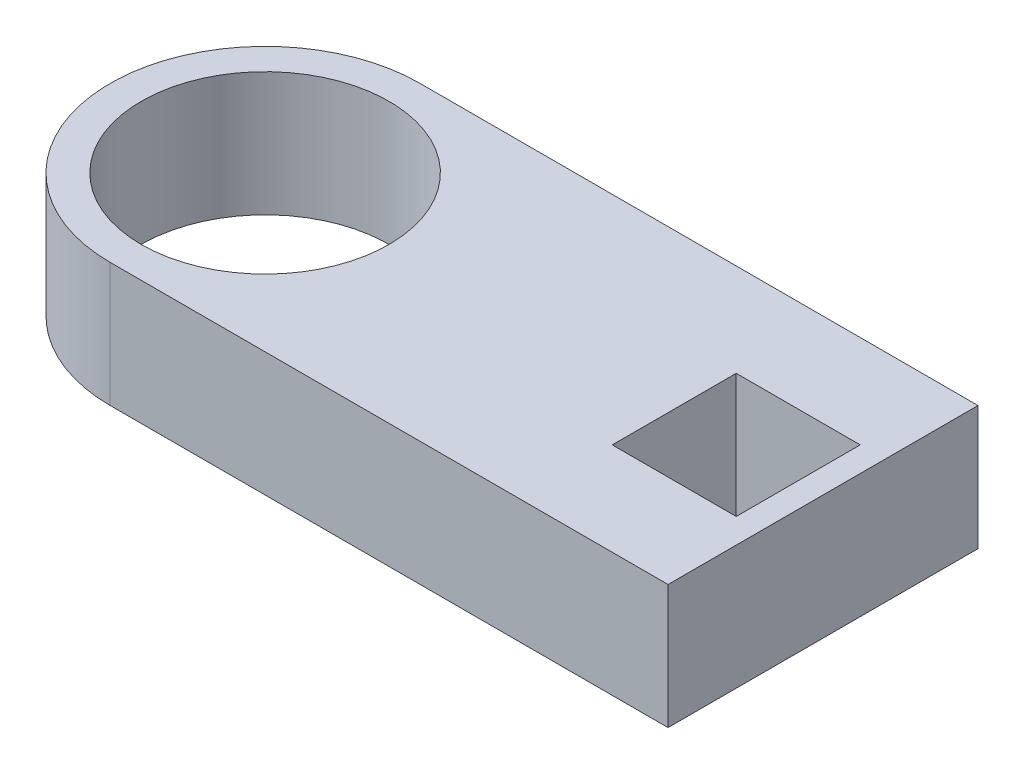
ISO-10303-21;
HEADER;
FILE_DESCRIPTION(('STEP AP214'),'2;1');
FILE_NAME('part.step','',(''),(''),'','','');
FILE_SCHEMA(('AUTOMOTIVE_DESIGN { 1 0 10303 214 1 1 1 1 }'));
ENDSEC;
DATA;
#1=APPLICATION_CONTEXT('core data for automotive mechanical design processes');
#2=APPLICATION_PROTOCOL_DEFINITION('international standard','automotive_design',2000,#1);
#3=PRODUCT_CONTEXT('',#1,'mechanical');
#4=PRODUCT('Part','Part','',(#3));
#5=PRODUCT_RELATED_PRODUCT_CATEGORY('part','',(#4));
#6=PRODUCT_DEFINITION_FORMATION('','',#4);
#7=PRODUCT_DEFINITION_CONTEXT('part definition',#1,'design');
#8=PRODUCT_DEFINITION('design','',#6,#7);
#9=PRODUCT_DEFINITION_SHAPE('','',#8);
#10=(LENGTH_UNIT() NAMED_UNIT(*) SI_UNIT(.MILLI.,.METRE.));
#11=(NAMED_UNIT(*) PLANE_ANGLE_UNIT() SI_UNIT($,.RADIAN.));
#12=(NAMED_UNIT(*) SI_UNIT($,.STERADIAN.) SOLID_ANGLE_UNIT());
#13=UNCERTAINTY_MEASURE_WITH_UNIT(LENGTH_MEASURE(1.E-05),#10,'distance_accuracy_value','');
#14=(GEOMETRIC_REPRESENTATION_CONTEXT(3) GLOBAL_UNCERTAINTY_ASSIGNED_CONTEXT((#13)) GLOBAL_UNIT_ASSIGNED_CONTEXT((#10,
#11,#12)) REPRESENTATION_CONTEXT('',''));
#15=CARTESIAN_POINT('',(0.,0.,0.));
#16=DIRECTION('',(0.,0.,1.));
#17=DIRECTION('',(1.,0.,0.));
#18=AXIS2_PLACEMENT_3D('',#15,#16,#17);
#19=CARTESIAN_POINT('',(0.,10.,-12.5));
#20=DIRECTION('',(0.,1.,0.));
#21=DIRECTION('',(0.,0.,1.));
#22=AXIS2_PLACEMENT_3D('',#19,#20,#21);
#23=PLANE('',#22);
#24=CARTESIAN_POINT('',(0.,10.,-12.5));
#25=DIRECTION('',(0.,1.,0.));
#26=DIRECTION('',(0.,0.,1.));
#27=AXIS2_PLACEMENT_3D('',#24,#25,#26);
#28=CIRCLE('',#27,12.5);
#29=CARTESIAN_POINT('',(0.,10.,-25.));
#30=VERTEX_POINT('',#29);
#31=CARTESIAN_POINT('',(0.,10.,0.));
#32=VERTEX_POINT('',#31);
#33=EDGE_CURVE('E140',#30,#32,#28,.T.);
#34=ORIENTED_EDGE('',*,*,#33,.T.);
#35=DIRECTION('',(1.,0.,0.));
#36=VECTOR('',#35,1.);
#37=CARTESIAN_POINT('',(0.,10.,0.));
#38=LINE('',#37,#36);
#39=CARTESIAN_POINT('',(45.,10.,0.));
#40=VERTEX_POINT('',#39);
#41=EDGE_CURVE('E143',#32,#40,#38,.T.);
#42=ORIENTED_EDGE('',*,*,#41,.T.);
#43=DIRECTION('',(0.,0.,-1.));
#44=VECTOR('',#43,1.);
#45=CARTESIAN_POINT('',(45.,10.,0.));
#46=LINE('',#45,#44);
#47=CARTESIAN_POINT('',(45.,10.,-25.));
#48=VERTEX_POINT('',#47);
#49=EDGE_CURVE('E146',#40,#48,#46,.T.);
#50=ORIENTED_EDGE('',*,*,#49,.T.);
#51=DIRECTION('',(-1.,0.,0.));
#52=VECTOR('',#51,1.);
#53=CARTESIAN_POINT('',(0.,10.,-25.));
#54=LINE('',#53,#52);
#55=EDGE_CURVE('E148',#48,#30,#54,.T.);
#56=ORIENTED_EDGE('',*,*,#55,.T.);
#57=EDGE_LOOP('',(#34,#42,#50,#56));
#58=FACE_BOUND('',#57,.T.);
#59=CARTESIAN_POINT('',(0.,10.,-12.5));
#60=DIRECTION('',(0.,1.,0.));
#61=DIRECTION('',(0.,0.,1.));
#62=AXIS2_PLACEMENT_3D('',#59,#60,#61);
#63=CIRCLE('',#62,10.);
#64=CARTESIAN_POINT('',(0.,10.,-2.5));
#65=VERTEX_POINT('',#64);
#66=EDGE_CURVE('E134',#65,#65,#63,.T.);
#67=ORIENTED_EDGE('',*,*,#66,.F.);
#68=EDGE_LOOP('',(#67));
#69=FACE_BOUND('',#68,.T.);
#70=DIRECTION('',(-1.,0.,0.));
#71=VECTOR('',#70,1.);
#72=CARTESIAN_POINT('',(43.,10.,-17.5));
#73=LINE('',#72,#71);
#74=CARTESIAN_POINT('',(43.,10.,-17.5));
#75=VERTEX_POINT('',#74);
#76=CARTESIAN_POINT('',(33.,10.,-17.5));
#77=VERTEX_POINT('',#76);
#78=EDGE_CURVE('E106',#75,#77,#73,.T.);
#79=ORIENTED_EDGE('',*,*,#78,.F.);
#80=DIRECTION('',(0.,0.,-1.));
#81=VECTOR('',#80,1.);
#82=CARTESIAN_POINT('',(43.,10.,-17.5));
#83=LINE('',#82,#81);
#84=CARTESIAN_POINT('',(43.,10.,-7.50000000000001));
#85=VERTEX_POINT('',#84);
#86=EDGE_CURVE('E98',#85,#75,#83,.T.);
#87=ORIENTED_EDGE('',*,*,#86,.F.);
#88=DIRECTION('',(1.,0.,0.));
#89=VECTOR('',#88,1.);
#90=CARTESIAN_POINT('',(43.,10.,-7.50000000000001));
#91=LINE('',#90,#89);
#92=CARTESIAN_POINT('',(33.,10.,-7.5));
#93=VERTEX_POINT('',#92);
#94=EDGE_CURVE('E120',#93,#85,#91,.T.);
#95=ORIENTED_EDGE('',*,*,#94,.F.);
#96=DIRECTION('',(0.,0.,1.));
#97=VECTOR('',#96,1.);
#98=CARTESIAN_POINT('',(33.,10.,-17.5));
#99=LINE('',#98,#97);
#100=EDGE_CURVE('E118',#77,#93,#99,.T.);
#101=ORIENTED_EDGE('',*,*,#100,.F.);
#102=EDGE_LOOP('',(#79,#87,#95,#101));
#103=FACE_BOUND('',#102,.T.);
#104=ADVANCED_FACE('F33',(#58,#69,#103),#23,.T.);
#105=CARTESIAN_POINT('',(0.,0.,-12.5));
#106=DIRECTION('',(0.,1.,0.));
#107=DIRECTION('',(0.,0.,1.));
#108=AXIS2_PLACEMENT_3D('',#105,#106,#107);
#109=PLANE('',#108);
#110=CARTESIAN_POINT('',(0.,0.,-12.5));
#111=DIRECTION('',(0.,1.,0.));
#112=DIRECTION('',(0.,0.,1.));
#113=AXIS2_PLACEMENT_3D('',#110,#111,#112);
#114=CIRCLE('',#113,10.);
#115=CARTESIAN_POINT('',(0.,0.,-2.5));
#116=VERTEX_POINT('',#115);
#117=EDGE_CURVE('E114',#116,#116,#114,.T.);
#118=ORIENTED_EDGE('',*,*,#117,.T.);
#119=EDGE_LOOP('',(#118));
#120=FACE_BOUND('',#119,.T.);
#121=CARTESIAN_POINT('',(0.,0.,-12.5));
#122=DIRECTION('',(0.,1.,0.));
#123=DIRECTION('',(0.,0.,1.));
#124=AXIS2_PLACEMENT_3D('',#121,#122,#123);
#125=CIRCLE('',#124,12.5);
#126=CARTESIAN_POINT('',(0.,0.,-25.));
#127=VERTEX_POINT('',#126);
#128=CARTESIAN_POINT('',(0.,0.,0.));
#129=VERTEX_POINT('',#128);
#130=EDGE_CURVE('E137',#127,#129,#125,.T.);
#131=ORIENTED_EDGE('',*,*,#130,.F.);
#132=DIRECTION('',(-1.,0.,0.));
#133=VECTOR('',#132,1.);
#134=CARTESIAN_POINT('',(0.,0.,-25.));
#135=LINE('',#134,#133);
#136=CARTESIAN_POINT('',(45.,0.,-25.));
#137=VERTEX_POINT('',#136);
#138=EDGE_CURVE('E144',#137,#127,#135,.T.);
#139=ORIENTED_EDGE('',*,*,#138,.F.);
#140=DIRECTION('',(0.,0.,-1.));
#141=VECTOR('',#140,1.);
#142=CARTESIAN_POINT('',(45.,0.,0.));
#143=LINE('',#142,#141);
#144=CARTESIAN_POINT('',(45.,0.,0.));
#145=VERTEX_POINT('',#144);
#146=EDGE_CURVE('E155',#145,#137,#143,.T.);
#147=ORIENTED_EDGE('',*,*,#146,.F.);
#148=DIRECTION('',(1.,0.,0.));
#149=VECTOR('',#148,1.);
#150=CARTESIAN_POINT('',(0.,0.,0.));
#151=LINE('',#150,#149);
#152=EDGE_CURVE('E153',#129,#145,#151,.T.);
#153=ORIENTED_EDGE('',*,*,#152,.F.);
#154=EDGE_LOOP('',(#131,#139,#147,#153));
#155=FACE_BOUND('',#154,.T.);
#156=DIRECTION('',(0.,0.,-1.));
#157=VECTOR('',#156,1.);
#158=CARTESIAN_POINT('',(43.,0.,-17.5));
#159=LINE('',#158,#157);
#160=CARTESIAN_POINT('',(43.,0.,-7.50000000000001));
#161=VERTEX_POINT('',#160);
#162=CARTESIAN_POINT('',(43.,0.,-17.5));
#163=VERTEX_POINT('',#162);
#164=EDGE_CURVE('E56',#161,#163,#159,.T.);
#165=ORIENTED_EDGE('',*,*,#164,.T.);
#166=DIRECTION('',(-1.,0.,0.));
#167=VECTOR('',#166,1.);
#168=CARTESIAN_POINT('',(43.,0.,-17.5));
#169=LINE('',#168,#167);
#170=CARTESIAN_POINT('',(33.,0.,-17.5));
#171=VERTEX_POINT('',#170);
#172=EDGE_CURVE('E113',#163,#171,#169,.T.);
#173=ORIENTED_EDGE('',*,*,#172,.T.);
#174=DIRECTION('',(0.,0.,1.));
#175=VECTOR('',#174,1.);
#176=CARTESIAN_POINT('',(33.,0.,-17.5));
#177=LINE('',#176,#175);
#178=CARTESIAN_POINT('',(33.,0.,-7.5));
#179=VERTEX_POINT('',#178);
#180=EDGE_CURVE('E126',#171,#179,#177,.T.);
#181=ORIENTED_EDGE('',*,*,#180,.T.);
#182=DIRECTION('',(1.,0.,0.));
#183=VECTOR('',#182,1.);
#184=CARTESIAN_POINT('',(43.,0.,-7.50000000000001));
#185=LINE('',#184,#183);
#186=EDGE_CURVE('E107',#179,#161,#185,.T.);
#187=ORIENTED_EDGE('',*,*,#186,.T.);
#188=EDGE_LOOP('',(#165,#173,#181,#187));
#189=FACE_BOUND('',#188,.T.);
#190=ADVANCED_FACE('F173',(#120,#155,#189),#109,.F.);
#191=CARTESIAN_POINT('',(0.,10.,-12.5));
#192=DIRECTION('',(0.,-1.,0.));
#193=DIRECTION('',(0.,0.,-1.));
#194=AXIS2_PLACEMENT_3D('',#191,#192,#193);
#195=CYLINDRICAL_SURFACE('',#194,12.5);
#196=ORIENTED_EDGE('',*,*,#130,.T.);
#197=DIRECTION('',(0.,-1.,0.));
#198=VECTOR('',#197,1.);
#199=CARTESIAN_POINT('',(0.,10.,0.));
#200=LINE('',#199,#198);
#201=EDGE_CURVE('E11',#32,#129,#200,.T.);
#202=ORIENTED_EDGE('',*,*,#201,.F.);
#203=ORIENTED_EDGE('',*,*,#33,.F.);
#204=DIRECTION('',(0.,-1.,0.));
#205=VECTOR('',#204,1.);
#206=CARTESIAN_POINT('',(0.,10.,-25.));
#207=LINE('',#206,#205);
#208=EDGE_CURVE('E150',#30,#127,#207,.T.);
#209=ORIENTED_EDGE('',*,*,#208,.T.);
#210=EDGE_LOOP('',(#196,#202,#203,#209));
#211=FACE_BOUND('',#210,.T.);
#212=ADVANCED_FACE('F35',(#211),#195,.T.);
#213=CARTESIAN_POINT('',(0.,10.,0.));
#214=DIRECTION('',(0.,0.,-1.));
#215=DIRECTION('',(-1.,0.,0.));
#216=AXIS2_PLACEMENT_3D('',#213,#214,#215);
#217=PLANE('',#216);
#218=ORIENTED_EDGE('',*,*,#152,.T.);
#219=DIRECTION('',(0.,-1.,0.));
#220=VECTOR('',#219,1.);
#221=CARTESIAN_POINT('',(45.,10.,0.));
#222=LINE('',#221,#220);
#223=EDGE_CURVE('E41',#40,#145,#222,.T.);
#224=ORIENTED_EDGE('',*,*,#223,.F.);
#225=ORIENTED_EDGE('',*,*,#41,.F.);
#226=ORIENTED_EDGE('',*,*,#201,.T.);
#227=EDGE_LOOP('',(#218,#224,#225,#226));
#228=FACE_BOUND('',#227,.T.);
#229=ADVANCED_FACE('F184',(#228),#217,.F.);
#230=CARTESIAN_POINT('',(45.,10.,0.));
#231=DIRECTION('',(-1.,0.,0.));
#232=DIRECTION('',(0.,0.,1.));
#233=AXIS2_PLACEMENT_3D('',#230,#231,#232);
#234=PLANE('',#233);
#235=ORIENTED_EDGE('',*,*,#146,.T.);
#236=DIRECTION('',(0.,-1.,0.));
#237=VECTOR('',#236,1.);
#238=CARTESIAN_POINT('',(45.,10.,-25.));
#239=LINE('',#238,#237);
#240=EDGE_CURVE('E160',#48,#137,#239,.T.);
#241=ORIENTED_EDGE('',*,*,#240,.F.);
#242=ORIENTED_EDGE('',*,*,#49,.F.);
#243=ORIENTED_EDGE('',*,*,#223,.T.);
#244=EDGE_LOOP('',(#235,#241,#242,#243));
#245=FACE_BOUND('',#244,.T.);
#246=ADVANCED_FACE('F167',(#245),#234,.F.);
#247=CARTESIAN_POINT('',(0.,10.,-25.));
#248=DIRECTION('',(0.,0.,1.));
#249=DIRECTION('',(1.,0.,0.));
#250=AXIS2_PLACEMENT_3D('',#247,#248,#249);
#251=PLANE('',#250);
#252=ORIENTED_EDGE('',*,*,#138,.T.);
#253=ORIENTED_EDGE('',*,*,#208,.F.);
#254=ORIENTED_EDGE('',*,*,#55,.F.);
#255=ORIENTED_EDGE('',*,*,#240,.T.);
#256=EDGE_LOOP('',(#252,#253,#254,#255));
#257=FACE_BOUND('',#256,.T.);
#258=ADVANCED_FACE('F177',(#257),#251,.F.);
#259=CARTESIAN_POINT('',(0.,10.,-12.5));
#260=DIRECTION('',(0.,-1.,0.));
#261=DIRECTION('',(0.,0.,-1.));
#262=AXIS2_PLACEMENT_3D('',#259,#260,#261);
#263=CYLINDRICAL_SURFACE('',#262,10.);
#264=ORIENTED_EDGE('',*,*,#66,.T.);
#265=EDGE_LOOP('',(#264));
#266=FACE_BOUND('',#265,.T.);
#267=ORIENTED_EDGE('',*,*,#117,.F.);
#268=EDGE_LOOP('',(#267));
#269=FACE_BOUND('',#268,.T.);
#270=ADVANCED_FACE('F199',(#266,#269),#263,.F.);
#271=CARTESIAN_POINT('',(43.,10.,-17.5));
#272=DIRECTION('',(-1.,0.,0.));
#273=DIRECTION('',(0.,0.,1.));
#274=AXIS2_PLACEMENT_3D('',#271,#272,#273);
#275=PLANE('',#274);
#276=ORIENTED_EDGE('',*,*,#164,.F.);
#277=DIRECTION('',(0.,-1.,0.));
#278=VECTOR('',#277,1.);
#279=CARTESIAN_POINT('',(43.,10.,-7.50000000000001));
#280=LINE('',#279,#278);
#281=EDGE_CURVE('E102',#85,#161,#280,.T.);
#282=ORIENTED_EDGE('',*,*,#281,.F.);
#283=ORIENTED_EDGE('',*,*,#86,.T.);
#284=DIRECTION('',(0.,-1.,0.));
#285=VECTOR('',#284,1.);
#286=CARTESIAN_POINT('',(43.,10.,-17.5));
#287=LINE('',#286,#285);
#288=EDGE_CURVE('E101',#75,#163,#287,.T.);
#289=ORIENTED_EDGE('',*,*,#288,.T.);
#290=EDGE_LOOP('',(#276,#282,#283,#289));
#291=FACE_BOUND('',#290,.T.);
#292=ADVANCED_FACE('F100',(#291),#275,.T.);
#293=CARTESIAN_POINT('',(43.,10.,-17.5));
#294=DIRECTION('',(0.,0.,1.));
#295=DIRECTION('',(1.,0.,0.));
#296=AXIS2_PLACEMENT_3D('',#293,#294,#295);
#297=PLANE('',#296);
#298=ORIENTED_EDGE('',*,*,#172,.F.);
#299=ORIENTED_EDGE('',*,*,#288,.F.);
#300=ORIENTED_EDGE('',*,*,#78,.T.);
#301=DIRECTION('',(0.,-1.,0.));
#302=VECTOR('',#301,1.);
#303=CARTESIAN_POINT('',(33.,10.,-17.5));
#304=LINE('',#303,#302);
#305=EDGE_CURVE('E115',#77,#171,#304,.T.);
#306=ORIENTED_EDGE('',*,*,#305,.T.);
#307=EDGE_LOOP('',(#298,#299,#300,#306));
#308=FACE_BOUND('',#307,.T.);
#309=ADVANCED_FACE('F110',(#308),#297,.T.);
#310=CARTESIAN_POINT('',(33.,10.,-17.5));
#311=DIRECTION('',(1.,0.,0.));
#312=DIRECTION('',(0.,0.,-1.));
#313=AXIS2_PLACEMENT_3D('',#310,#311,#312);
#314=PLANE('',#313);
#315=ORIENTED_EDGE('',*,*,#180,.F.);
#316=ORIENTED_EDGE('',*,*,#305,.F.);
#317=ORIENTED_EDGE('',*,*,#100,.T.);
#318=DIRECTION('',(0.,-1.,0.));
#319=VECTOR('',#318,1.);
#320=CARTESIAN_POINT('',(33.,10.,-7.5));
#321=LINE('',#320,#319);
#322=EDGE_CURVE('E48',#93,#179,#321,.T.);
#323=ORIENTED_EDGE('',*,*,#322,.T.);
#324=EDGE_LOOP('',(#315,#316,#317,#323));
#325=FACE_BOUND('',#324,.T.);
#326=ADVANCED_FACE('F216',(#325),#314,.T.);
#327=CARTESIAN_POINT('',(43.,10.,-7.50000000000001));
#328=DIRECTION('',(0.,0.,-1.));
#329=DIRECTION('',(-1.,0.,0.));
#330=AXIS2_PLACEMENT_3D('',#327,#328,#329);
#331=PLANE('',#330);
#332=ORIENTED_EDGE('',*,*,#186,.F.);
#333=ORIENTED_EDGE('',*,*,#322,.F.);
#334=ORIENTED_EDGE('',*,*,#94,.T.);
#335=ORIENTED_EDGE('',*,*,#281,.T.);
#336=EDGE_LOOP('',(#332,#333,#334,#335));
#337=FACE_BOUND('',#336,.T.);
#338=ADVANCED_FACE('F221',(#337),#331,.T.);
#339=CLOSED_SHELL('',(#104,#190,#212,#229,#246,#258,#270,#292,#309,#326,#338));
#340=MANIFOLD_SOLID_BREP('B2',#339);
#341=ADVANCED_BREP_SHAPE_REPRESENTATION('',(#18,#340),#14);
#342=SHAPE_DEFINITION_REPRESENTATION(#9,#341);
ENDSEC;
END-ISO-10303-21;
